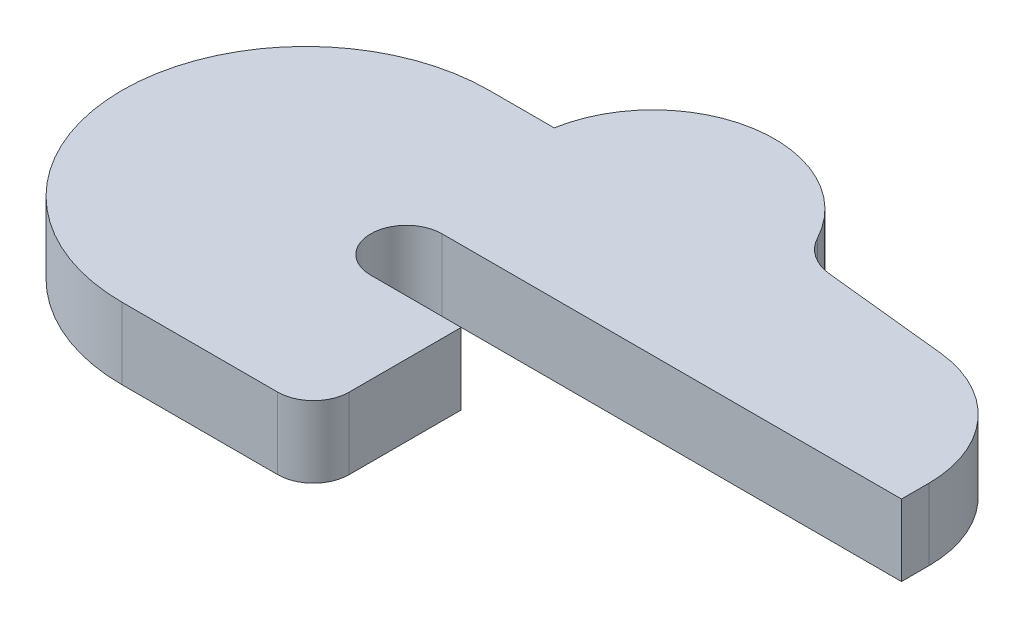
ISO-10303-21;
HEADER;
FILE_DESCRIPTION(('STEP AP214'),'2;1');
FILE_NAME('part.step','',(''),(''),'','','');
FILE_SCHEMA(('AUTOMOTIVE_DESIGN { 1 0 10303 214 1 1 1 1 }'));
ENDSEC;
DATA;
#1=APPLICATION_CONTEXT('core data for automotive mechanical design processes');
#2=APPLICATION_PROTOCOL_DEFINITION('international standard','automotive_design',2000,#1);
#3=PRODUCT_CONTEXT('',#1,'mechanical');
#4=PRODUCT('Part','Part','',(#3));
#5=PRODUCT_RELATED_PRODUCT_CATEGORY('part','',(#4));
#6=PRODUCT_DEFINITION_FORMATION('','',#4);
#7=PRODUCT_DEFINITION_CONTEXT('part definition',#1,'design');
#8=PRODUCT_DEFINITION('design','',#6,#7);
#9=PRODUCT_DEFINITION_SHAPE('','',#8);
#10=(LENGTH_UNIT() NAMED_UNIT(*) SI_UNIT(.MILLI.,.METRE.));
#11=(NAMED_UNIT(*) PLANE_ANGLE_UNIT() SI_UNIT($,.RADIAN.));
#12=(NAMED_UNIT(*) SI_UNIT($,.STERADIAN.) SOLID_ANGLE_UNIT());
#13=UNCERTAINTY_MEASURE_WITH_UNIT(LENGTH_MEASURE(1.E-05),#10,'distance_accuracy_value','');
#14=(GEOMETRIC_REPRESENTATION_CONTEXT(3) GLOBAL_UNCERTAINTY_ASSIGNED_CONTEXT((#13)) GLOBAL_UNIT_ASSIGNED_CONTEXT((#10,
#11,#12)) REPRESENTATION_CONTEXT('',''));
#15=CARTESIAN_POINT('',(0.,0.,0.));
#16=DIRECTION('',(0.,0.,1.));
#17=DIRECTION('',(1.,0.,0.));
#18=AXIS2_PLACEMENT_3D('',#15,#16,#17);
#19=CARTESIAN_POINT('',(0.,3.,4.7));
#20=DIRECTION('',(-1.,0.,0.));
#21=DIRECTION('',(0.,0.,1.));
#22=AXIS2_PLACEMENT_3D('',#19,#20,#21);
#23=PLANE('',#22);
#24=DIRECTION('',(0.,0.,-1.));
#25=VECTOR('',#24,1.);
#26=CARTESIAN_POINT('',(0.,0.,4.7));
#27=LINE('',#26,#25);
#28=CARTESIAN_POINT('',(0.,0.,4.7));
#29=VERTEX_POINT('',#28);
#30=CARTESIAN_POINT('',(0.,0.,0.));
#31=VERTEX_POINT('',#30);
#32=EDGE_CURVE('E159',#29,#31,#27,.T.);
#33=ORIENTED_EDGE('',*,*,#32,.T.);
#34=DIRECTION('',(0.,-1.,0.));
#35=VECTOR('',#34,1.);
#36=CARTESIAN_POINT('',(0.,3.,0.));
#37=LINE('',#36,#35);
#38=CARTESIAN_POINT('',(0.,3.,0.));
#39=VERTEX_POINT('',#38);
#40=EDGE_CURVE('E11',#39,#31,#37,.T.);
#41=ORIENTED_EDGE('',*,*,#40,.F.);
#42=DIRECTION('',(0.,0.,-1.));
#43=VECTOR('',#42,1.);
#44=CARTESIAN_POINT('',(0.,3.,4.7));
#45=LINE('',#44,#43);
#46=CARTESIAN_POINT('',(0.,3.,4.7));
#47=VERTEX_POINT('',#46);
#48=EDGE_CURVE('E183',#47,#39,#45,.T.);
#49=ORIENTED_EDGE('',*,*,#48,.F.);
#50=DIRECTION('',(0.,-1.,0.));
#51=VECTOR('',#50,1.);
#52=CARTESIAN_POINT('',(0.,3.,4.7));
#53=LINE('',#52,#51);
#54=EDGE_CURVE('E155',#47,#29,#53,.T.);
#55=ORIENTED_EDGE('',*,*,#54,.T.);
#56=EDGE_LOOP('',(#33,#41,#49,#55));
#57=FACE_BOUND('',#56,.T.);
#58=ADVANCED_FACE('F33',(#57),#23,.F.);
#59=CARTESIAN_POINT('',(0.,3.,0.));
#60=DIRECTION('',(0.,0.,1.));
#61=DIRECTION('',(1.,0.,0.));
#62=AXIS2_PLACEMENT_3D('',#59,#60,#61);
#63=PLANE('',#62);
#64=DIRECTION('',(-1.,0.,0.));
#65=VECTOR('',#64,1.);
#66=CARTESIAN_POINT('',(0.,0.,0.));
#67=LINE('',#66,#65);
#68=CARTESIAN_POINT('',(-3.8,0.,0.));
#69=VERTEX_POINT('',#68);
#70=EDGE_CURVE('E162',#31,#69,#67,.T.);
#71=ORIENTED_EDGE('',*,*,#70,.T.);
#72=DIRECTION('',(0.,-1.,0.));
#73=VECTOR('',#72,1.);
#74=CARTESIAN_POINT('',(-3.8,3.,0.));
#75=LINE('',#74,#73);
#76=CARTESIAN_POINT('',(-3.8,3.,0.));
#77=VERTEX_POINT('',#76);
#78=EDGE_CURVE('E41',#77,#69,#75,.T.);
#79=ORIENTED_EDGE('',*,*,#78,.F.);
#80=DIRECTION('',(-1.,0.,0.));
#81=VECTOR('',#80,1.);
#82=CARTESIAN_POINT('',(0.,3.,0.));
#83=LINE('',#82,#81);
#84=EDGE_CURVE('E107',#39,#77,#83,.T.);
#85=ORIENTED_EDGE('',*,*,#84,.F.);
#86=ORIENTED_EDGE('',*,*,#40,.T.);
#87=EDGE_LOOP('',(#71,#79,#85,#86));
#88=FACE_BOUND('',#87,.T.);
#89=ADVANCED_FACE('F266',(#88),#63,.F.);
#90=CARTESIAN_POINT('',(-3.8,3.,-1.5));
#91=DIRECTION('',(0.,-1.,0.));
#92=DIRECTION('',(0.,0.,-1.));
#93=AXIS2_PLACEMENT_3D('',#90,#91,#92);
#94=CYLINDRICAL_SURFACE('',#93,1.5);
#95=CARTESIAN_POINT('',(-3.8,0.,-1.5));
#96=DIRECTION('',(0.,-1.,0.));
#97=DIRECTION('',(0.,0.,-1.));
#98=AXIS2_PLACEMENT_3D('',#95,#96,#97);
#99=CIRCLE('',#98,1.5);
#100=CARTESIAN_POINT('',(-3.8,0.,-3.));
#101=VERTEX_POINT('',#100);
#102=EDGE_CURVE('E164',#69,#101,#99,.T.);
#103=ORIENTED_EDGE('',*,*,#102,.T.);
#104=DIRECTION('',(0.,-1.,0.));
#105=VECTOR('',#104,1.);
#106=CARTESIAN_POINT('',(-3.8,3.,-3.));
#107=LINE('',#106,#105);
#108=CARTESIAN_POINT('',(-3.8,3.,-3.));
#109=VERTEX_POINT('',#108);
#110=EDGE_CURVE('E205',#109,#101,#107,.T.);
#111=ORIENTED_EDGE('',*,*,#110,.F.);
#112=CARTESIAN_POINT('',(-3.8,3.,-1.5));
#113=DIRECTION('',(0.,-1.,0.));
#114=DIRECTION('',(0.,0.,-1.));
#115=AXIS2_PLACEMENT_3D('',#112,#113,#114);
#116=CIRCLE('',#115,1.5);
#117=EDGE_CURVE('E213',#77,#109,#116,.T.);
#118=ORIENTED_EDGE('',*,*,#117,.F.);
#119=ORIENTED_EDGE('',*,*,#78,.T.);
#120=EDGE_LOOP('',(#103,#111,#118,#119));
#121=FACE_BOUND('',#120,.T.);
#122=ADVANCED_FACE('F211',(#121),#94,.F.);
#123=CARTESIAN_POINT('',(-3.8,3.,-3.));
#124=DIRECTION('',(0.,0.,-1.));
#125=DIRECTION('',(-1.,0.,0.));
#126=AXIS2_PLACEMENT_3D('',#123,#124,#125);
#127=PLANE('',#126);
#128=DIRECTION('',(1.,0.,0.));
#129=VECTOR('',#128,1.);
#130=CARTESIAN_POINT('',(-3.8,0.,-3.));
#131=LINE('',#130,#129);
#132=CARTESIAN_POINT('',(15.47,0.,-3.));
#133=VERTEX_POINT('',#132);
#134=EDGE_CURVE('E166',#101,#133,#131,.T.);
#135=ORIENTED_EDGE('',*,*,#134,.T.);
#136=DIRECTION('',(0.,-1.,0.));
#137=VECTOR('',#136,1.);
#138=CARTESIAN_POINT('',(15.47,3.,-3.));
#139=LINE('',#138,#137);
#140=CARTESIAN_POINT('',(15.47,3.,-3.));
#141=VERTEX_POINT('',#140);
#142=EDGE_CURVE('E202',#141,#133,#139,.T.);
#143=ORIENTED_EDGE('',*,*,#142,.F.);
#144=DIRECTION('',(1.,0.,0.));
#145=VECTOR('',#144,1.);
#146=CARTESIAN_POINT('',(-3.8,3.,-3.));
#147=LINE('',#146,#145);
#148=EDGE_CURVE('E231',#109,#141,#147,.T.);
#149=ORIENTED_EDGE('',*,*,#148,.F.);
#150=ORIENTED_EDGE('',*,*,#110,.T.);
#151=EDGE_LOOP('',(#135,#143,#149,#150));
#152=FACE_BOUND('',#151,.T.);
#153=ADVANCED_FACE('F222',(#152),#127,.F.);
#154=CARTESIAN_POINT('',(15.47,3.,-3.));
#155=DIRECTION('',(-1.,0.,0.));
#156=DIRECTION('',(0.,0.,1.));
#157=AXIS2_PLACEMENT_3D('',#154,#155,#156);
#158=PLANE('',#157);
#159=DIRECTION('',(0.,0.,-1.));
#160=VECTOR('',#159,1.);
#161=CARTESIAN_POINT('',(15.47,0.,-3.));
#162=LINE('',#161,#160);
#163=CARTESIAN_POINT('',(15.47,0.,-4.14901673840883));
#164=VERTEX_POINT('',#163);
#165=EDGE_CURVE('E168',#133,#164,#162,.T.);
#166=ORIENTED_EDGE('',*,*,#165,.T.);
#167=DIRECTION('',(0.,-1.,0.));
#168=VECTOR('',#167,1.);
#169=CARTESIAN_POINT('',(15.47,3.,-4.14901673840883));
#170=LINE('',#169,#168);
#171=CARTESIAN_POINT('',(15.47,3.,-4.14901673840883));
#172=VERTEX_POINT('',#171);
#173=EDGE_CURVE('E199',#172,#164,#170,.T.);
#174=ORIENTED_EDGE('',*,*,#173,.F.);
#175=DIRECTION('',(0.,0.,-1.));
#176=VECTOR('',#175,1.);
#177=CARTESIAN_POINT('',(15.47,3.,-3.));
#178=LINE('',#177,#176);
#179=EDGE_CURVE('E228',#141,#172,#178,.T.);
#180=ORIENTED_EDGE('',*,*,#179,.F.);
#181=ORIENTED_EDGE('',*,*,#142,.T.);
#182=EDGE_LOOP('',(#166,#174,#180,#181));
#183=FACE_BOUND('',#182,.T.);
#184=ADVANCED_FACE('F226',(#183),#158,.F.);
#185=CARTESIAN_POINT('',(10.47,3.,-4.14901673840881));
#186=DIRECTION('',(0.,-1.,0.));
#187=DIRECTION('',(0.,0.,-1.));
#188=AXIS2_PLACEMENT_3D('',#185,#186,#187);
#189=CYLINDRICAL_SURFACE('',#188,5.);
#190=CARTESIAN_POINT('',(10.47,0.,-4.14901673840881));
#191=DIRECTION('',(0.,1.,0.));
#192=DIRECTION('',(0.,0.,1.));
#193=AXIS2_PLACEMENT_3D('',#190,#191,#192);
#194=CIRCLE('',#193,5.);
#195=CARTESIAN_POINT('',(10.9926423163383,0.,-9.12162621525017));
#196=VERTEX_POINT('',#195);
#197=EDGE_CURVE('E170',#164,#196,#194,.T.);
#198=ORIENTED_EDGE('',*,*,#197,.T.);
#199=DIRECTION('',(0.,-1.,0.));
#200=VECTOR('',#199,1.);
#201=CARTESIAN_POINT('',(10.9926423163383,3.,-9.12162621525017));
#202=LINE('',#201,#200);
#203=CARTESIAN_POINT('',(10.9926423163383,3.,-9.12162621525017));
#204=VERTEX_POINT('',#203);
#205=EDGE_CURVE('E196',#204,#196,#202,.T.);
#206=ORIENTED_EDGE('',*,*,#205,.F.);
#207=CARTESIAN_POINT('',(10.47,3.,-4.14901673840881));
#208=DIRECTION('',(0.,1.,0.));
#209=DIRECTION('',(0.,0.,1.));
#210=AXIS2_PLACEMENT_3D('',#207,#208,#209);
#211=CIRCLE('',#210,5.);
#212=EDGE_CURVE('E230',#172,#204,#211,.T.);
#213=ORIENTED_EDGE('',*,*,#212,.F.);
#214=ORIENTED_EDGE('',*,*,#173,.T.);
#215=EDGE_LOOP('',(#198,#206,#213,#214));
#216=FACE_BOUND('',#215,.T.);
#217=ADVANCED_FACE('F279',(#216),#189,.T.);
#218=CARTESIAN_POINT('',(5.78329531917426,3.,-9.66915064762065));
#219=DIRECTION('',(-0.104528463267655,0.,0.994521895368273));
#220=DIRECTION('',(0.994521895368273,0.,0.104528463267655));
#221=AXIS2_PLACEMENT_3D('',#218,#219,#220);
#222=PLANE('',#221);
#223=DIRECTION('',(-0.994521895368273,0.,-0.104528463267655));
#224=VECTOR('',#223,1.);
#225=CARTESIAN_POINT('',(5.78329531917426,0.,-9.66915064762065));
#226=LINE('',#225,#224);
#227=CARTESIAN_POINT('',(5.78329531917426,0.,-9.66915064762065));
#228=VERTEX_POINT('',#227);
#229=EDGE_CURVE('E172',#196,#228,#226,.T.);
#230=ORIENTED_EDGE('',*,*,#229,.T.);
#231=DIRECTION('',(0.,-1.,0.));
#232=VECTOR('',#231,1.);
#233=CARTESIAN_POINT('',(5.78329531917426,3.,-9.66915064762065));
#234=LINE('',#233,#232);
#235=CARTESIAN_POINT('',(5.78329531917426,3.,-9.66915064762065));
#236=VERTEX_POINT('',#235);
#237=EDGE_CURVE('E193',#236,#228,#234,.T.);
#238=ORIENTED_EDGE('',*,*,#237,.F.);
#239=DIRECTION('',(-0.994521895368273,0.,-0.104528463267655));
#240=VECTOR('',#239,1.);
#241=CARTESIAN_POINT('',(5.78329531917426,3.,-9.66915064762065));
#242=LINE('',#241,#240);
#243=EDGE_CURVE('E233',#204,#236,#242,.T.);
#244=ORIENTED_EDGE('',*,*,#243,.F.);
#245=ORIENTED_EDGE('',*,*,#205,.T.);
#246=EDGE_LOOP('',(#230,#238,#244,#245));
#247=FACE_BOUND('',#246,.T.);
#248=ADVANCED_FACE('F282',(#247),#222,.F.);
#249=CARTESIAN_POINT('',(5.99235224570956,3.,-11.6581944383572));
#250=DIRECTION('',(0.,-1.,0.));
#251=DIRECTION('',(0.,0.,-1.));
#252=AXIS2_PLACEMENT_3D('',#249,#250,#251);
#253=CYLINDRICAL_SURFACE('',#252,2.);
#254=CARTESIAN_POINT('',(5.99235224570956,0.,-11.6581944383572));
#255=DIRECTION('',(0.,-1.,0.));
#256=DIRECTION('',(0.,0.,1.));
#257=AXIS2_PLACEMENT_3D('',#254,#255,#256);
#258=CIRCLE('',#257,2.);
#259=CARTESIAN_POINT('',(4.22665742180696,0.,-10.7188745839713));
#260=VERTEX_POINT('',#259);
#261=EDGE_CURVE('E174',#228,#260,#258,.T.);
#262=ORIENTED_EDGE('',*,*,#261,.T.);
#263=DIRECTION('',(0.,-1.,0.));
#264=VECTOR('',#263,1.);
#265=CARTESIAN_POINT('',(4.22665742180696,3.,-10.7188745839713));
#266=LINE('',#265,#264);
#267=CARTESIAN_POINT('',(4.22665742180696,3.,-10.7188745839713));
#268=VERTEX_POINT('',#267);
#269=EDGE_CURVE('E190',#268,#260,#266,.T.);
#270=ORIENTED_EDGE('',*,*,#269,.F.);
#271=CARTESIAN_POINT('',(5.99235224570956,3.,-11.6581944383572));
#272=DIRECTION('',(0.,-1.,0.));
#273=DIRECTION('',(0.,0.,1.));
#274=AXIS2_PLACEMENT_3D('',#271,#272,#273);
#275=CIRCLE('',#274,2.);
#276=EDGE_CURVE('E239',#236,#268,#275,.T.);
#277=ORIENTED_EDGE('',*,*,#276,.F.);
#278=ORIENTED_EDGE('',*,*,#237,.T.);
#279=EDGE_LOOP('',(#262,#270,#277,#278));
#280=FACE_BOUND('',#279,.T.);
#281=ADVANCED_FACE('F286',(#280),#253,.F.);
#282=CARTESIAN_POINT('',(-0.27586437914468,3.,-8.32360895528724));
#283=DIRECTION('',(0.,-1.,0.));
#284=DIRECTION('',(0.,0.,-1.));
#285=AXIS2_PLACEMENT_3D('',#282,#283,#284);
#286=CYLINDRICAL_SURFACE('',#285,5.1);
#287=CARTESIAN_POINT('',(-0.27586437914468,0.,-8.32360895528724));
#288=DIRECTION('',(0.,1.,0.));
#289=DIRECTION('',(0.,0.,-1.));
#290=AXIS2_PLACEMENT_3D('',#287,#288,#289);
#291=CIRCLE('',#290,5.1);
#292=CARTESIAN_POINT('',(-5.3,0.,-9.2));
#293=VERTEX_POINT('',#292);
#294=EDGE_CURVE('E176',#260,#293,#291,.T.);
#295=ORIENTED_EDGE('',*,*,#294,.T.);
#296=DIRECTION('',(0.,-1.,0.));
#297=VECTOR('',#296,1.);
#298=CARTESIAN_POINT('',(-5.3,3.,-9.2));
#299=LINE('',#298,#297);
#300=CARTESIAN_POINT('',(-5.3,3.,-9.2));
#301=VERTEX_POINT('',#300);
#302=EDGE_CURVE('E187',#301,#293,#299,.T.);
#303=ORIENTED_EDGE('',*,*,#302,.F.);
#304=CARTESIAN_POINT('',(-0.27586437914468,3.,-8.32360895528724));
#305=DIRECTION('',(0.,1.,0.));
#306=DIRECTION('',(0.,0.,-1.));
#307=AXIS2_PLACEMENT_3D('',#304,#305,#306);
#308=CIRCLE('',#307,5.1);
#309=EDGE_CURVE('E241',#268,#301,#308,.T.);
#310=ORIENTED_EDGE('',*,*,#309,.F.);
#311=ORIENTED_EDGE('',*,*,#269,.T.);
#312=EDGE_LOOP('',(#295,#303,#310,#311));
#313=FACE_BOUND('',#312,.T.);
#314=ADVANCED_FACE('F247',(#313),#286,.T.);
#315=CARTESIAN_POINT('',(-5.3,3.,-9.2));
#316=DIRECTION('',(0.,0.,1.));
#317=DIRECTION('',(1.,0.,0.));
#318=AXIS2_PLACEMENT_3D('',#315,#316,#317);
#319=PLANE('',#318);
#320=DIRECTION('',(-1.,0.,0.));
#321=VECTOR('',#320,1.);
#322=CARTESIAN_POINT('',(-5.3,0.,-9.2));
#323=LINE('',#322,#321);
#324=CARTESIAN_POINT('',(-8.03,0.,-9.2));
#325=VERTEX_POINT('',#324);
#326=EDGE_CURVE('E178',#293,#325,#323,.T.);
#327=ORIENTED_EDGE('',*,*,#326,.T.);
#328=DIRECTION('',(0.,-1.,0.));
#329=VECTOR('',#328,1.);
#330=CARTESIAN_POINT('',(-8.03,3.,-9.2));
#331=LINE('',#330,#329);
#332=CARTESIAN_POINT('',(-8.03,3.,-9.2));
#333=VERTEX_POINT('',#332);
#334=EDGE_CURVE('E150',#333,#325,#331,.T.);
#335=ORIENTED_EDGE('',*,*,#334,.F.);
#336=DIRECTION('',(-1.,0.,0.));
#337=VECTOR('',#336,1.);
#338=CARTESIAN_POINT('',(-5.3,3.,-9.2));
#339=LINE('',#338,#337);
#340=EDGE_CURVE('E141',#301,#333,#339,.T.);
#341=ORIENTED_EDGE('',*,*,#340,.F.);
#342=ORIENTED_EDGE('',*,*,#302,.T.);
#343=EDGE_LOOP('',(#327,#335,#341,#342));
#344=FACE_BOUND('',#343,.T.);
#345=ADVANCED_FACE('F251',(#344),#319,.F.);
#346=CARTESIAN_POINT('',(-8.03,3.,-1.5));
#347=DIRECTION('',(0.,-1.,0.));
#348=DIRECTION('',(0.,0.,-1.));
#349=AXIS2_PLACEMENT_3D('',#346,#347,#348);
#350=CYLINDRICAL_SURFACE('',#349,7.7);
#351=CARTESIAN_POINT('',(-8.03,0.,-1.5));
#352=DIRECTION('',(0.,1.,0.));
#353=DIRECTION('',(0.,0.,1.));
#354=AXIS2_PLACEMENT_3D('',#351,#352,#353);
#355=CIRCLE('',#354,7.7);
#356=CARTESIAN_POINT('',(-8.03,0.,6.2));
#357=VERTEX_POINT('',#356);
#358=EDGE_CURVE('E149',#325,#357,#355,.T.);
#359=ORIENTED_EDGE('',*,*,#358,.T.);
#360=DIRECTION('',(0.,-1.,0.));
#361=VECTOR('',#360,1.);
#362=CARTESIAN_POINT('',(-8.03,3.,6.2));
#363=LINE('',#362,#361);
#364=CARTESIAN_POINT('',(-8.03,3.,6.2));
#365=VERTEX_POINT('',#364);
#366=EDGE_CURVE('E146',#365,#357,#363,.T.);
#367=ORIENTED_EDGE('',*,*,#366,.F.);
#368=CARTESIAN_POINT('',(-8.03,3.,-1.5));
#369=DIRECTION('',(0.,1.,0.));
#370=DIRECTION('',(0.,0.,1.));
#371=AXIS2_PLACEMENT_3D('',#368,#369,#370);
#372=CIRCLE('',#371,7.7);
#373=EDGE_CURVE('E135',#333,#365,#372,.T.);
#374=ORIENTED_EDGE('',*,*,#373,.F.);
#375=ORIENTED_EDGE('',*,*,#334,.T.);
#376=EDGE_LOOP('',(#359,#367,#374,#375));
#377=FACE_BOUND('',#376,.T.);
#378=ADVANCED_FACE('F147',(#377),#350,.T.);
#379=CARTESIAN_POINT('',(-8.03,3.,6.2));
#380=DIRECTION('',(0.,0.,-1.));
#381=DIRECTION('',(-1.,0.,0.));
#382=AXIS2_PLACEMENT_3D('',#379,#380,#381);
#383=PLANE('',#382);
#384=DIRECTION('',(1.,0.,0.));
#385=VECTOR('',#384,1.);
#386=CARTESIAN_POINT('',(-8.03,0.,6.2));
#387=LINE('',#386,#385);
#388=CARTESIAN_POINT('',(-1.5,0.,6.2));
#389=VERTEX_POINT('',#388);
#390=EDGE_CURVE('E93',#357,#389,#387,.T.);
#391=ORIENTED_EDGE('',*,*,#390,.T.);
#392=DIRECTION('',(0.,-1.,0.));
#393=VECTOR('',#392,1.);
#394=CARTESIAN_POINT('',(-1.5,3.,6.2));
#395=LINE('',#394,#393);
#396=CARTESIAN_POINT('',(-1.5,3.,6.2));
#397=VERTEX_POINT('',#396);
#398=EDGE_CURVE('E151',#397,#389,#395,.T.);
#399=ORIENTED_EDGE('',*,*,#398,.F.);
#400=DIRECTION('',(1.,0.,0.));
#401=VECTOR('',#400,1.);
#402=CARTESIAN_POINT('',(-8.03,3.,6.2));
#403=LINE('',#402,#401);
#404=EDGE_CURVE('E139',#365,#397,#403,.T.);
#405=ORIENTED_EDGE('',*,*,#404,.F.);
#406=ORIENTED_EDGE('',*,*,#366,.T.);
#407=EDGE_LOOP('',(#391,#399,#405,#406));
#408=FACE_BOUND('',#407,.T.);
#409=ADVANCED_FACE('F153',(#408),#383,.F.);
#410=CARTESIAN_POINT('',(-1.5,3.,4.7));
#411=DIRECTION('',(0.,-1.,0.));
#412=DIRECTION('',(0.,0.,-1.));
#413=AXIS2_PLACEMENT_3D('',#410,#411,#412);
#414=CYLINDRICAL_SURFACE('',#413,1.5);
#415=CARTESIAN_POINT('',(-1.5,0.,4.7));
#416=DIRECTION('',(0.,1.,0.));
#417=DIRECTION('',(0.,0.,1.));
#418=AXIS2_PLACEMENT_3D('',#415,#416,#417);
#419=CIRCLE('',#418,1.5);
#420=EDGE_CURVE('E99',#389,#29,#419,.T.);
#421=ORIENTED_EDGE('',*,*,#420,.T.);
#422=ORIENTED_EDGE('',*,*,#54,.F.);
#423=CARTESIAN_POINT('',(-1.5,3.,4.7));
#424=DIRECTION('',(0.,1.,0.));
#425=DIRECTION('',(0.,0.,1.));
#426=AXIS2_PLACEMENT_3D('',#423,#424,#425);
#427=CIRCLE('',#426,1.5);
#428=EDGE_CURVE('E49',#397,#47,#427,.T.);
#429=ORIENTED_EDGE('',*,*,#428,.F.);
#430=ORIENTED_EDGE('',*,*,#398,.T.);
#431=EDGE_LOOP('',(#421,#422,#429,#430));
#432=FACE_BOUND('',#431,.T.);
#433=ADVANCED_FACE('F255',(#432),#414,.T.);
#434=CARTESIAN_POINT('',(-3.8,3.,-1.5));
#435=DIRECTION('',(0.,-1.,0.));
#436=DIRECTION('',(0.,0.,-1.));
#437=AXIS2_PLACEMENT_3D('',#434,#435,#436);
#438=PLANE('',#437);
#439=ORIENTED_EDGE('',*,*,#48,.T.);
#440=ORIENTED_EDGE('',*,*,#84,.T.);
#441=ORIENTED_EDGE('',*,*,#117,.T.);
#442=ORIENTED_EDGE('',*,*,#148,.T.);
#443=ORIENTED_EDGE('',*,*,#179,.T.);
#444=ORIENTED_EDGE('',*,*,#212,.T.);
#445=ORIENTED_EDGE('',*,*,#243,.T.);
#446=ORIENTED_EDGE('',*,*,#276,.T.);
#447=ORIENTED_EDGE('',*,*,#309,.T.);
#448=ORIENTED_EDGE('',*,*,#340,.T.);
#449=ORIENTED_EDGE('',*,*,#373,.T.);
#450=ORIENTED_EDGE('',*,*,#404,.T.);
#451=ORIENTED_EDGE('',*,*,#428,.T.);
#452=EDGE_LOOP('',(#439,#440,#441,#442,#443,#444,#445,#446,#447,#448,#449,#450,#451));
#453=FACE_BOUND('',#452,.T.);
#454=ADVANCED_FACE('F137',(#453),#438,.F.);
#455=CARTESIAN_POINT('',(-3.8,0.,-1.5));
#456=DIRECTION('',(0.,-1.,0.));
#457=DIRECTION('',(0.,0.,-1.));
#458=AXIS2_PLACEMENT_3D('',#455,#456,#457);
#459=PLANE('',#458);
#460=ORIENTED_EDGE('',*,*,#32,.F.);
#461=ORIENTED_EDGE('',*,*,#420,.F.);
#462=ORIENTED_EDGE('',*,*,#390,.F.);
#463=ORIENTED_EDGE('',*,*,#358,.F.);
#464=ORIENTED_EDGE('',*,*,#326,.F.);
#465=ORIENTED_EDGE('',*,*,#294,.F.);
#466=ORIENTED_EDGE('',*,*,#261,.F.);
#467=ORIENTED_EDGE('',*,*,#229,.F.);
#468=ORIENTED_EDGE('',*,*,#197,.F.);
#469=ORIENTED_EDGE('',*,*,#165,.F.);
#470=ORIENTED_EDGE('',*,*,#134,.F.);
#471=ORIENTED_EDGE('',*,*,#102,.F.);
#472=ORIENTED_EDGE('',*,*,#70,.F.);
#473=EDGE_LOOP('',(#460,#461,#462,#463,#464,#465,#466,#467,#468,#469,#470,#471,#472));
#474=FACE_BOUND('',#473,.T.);
#475=ADVANCED_FACE('F217',(#474),#459,.T.);
#476=CLOSED_SHELL('',(#58,#89,#122,#153,#184,#217,#248,#281,#314,#345,#378,#409,#433,#454,#475));
#477=MANIFOLD_SOLID_BREP('B2',#476);
#478=ADVANCED_BREP_SHAPE_REPRESENTATION('',(#18,#477),#14);
#479=SHAPE_DEFINITION_REPRESENTATION(#9,#478);
ENDSEC;
END-ISO-10303-21;
